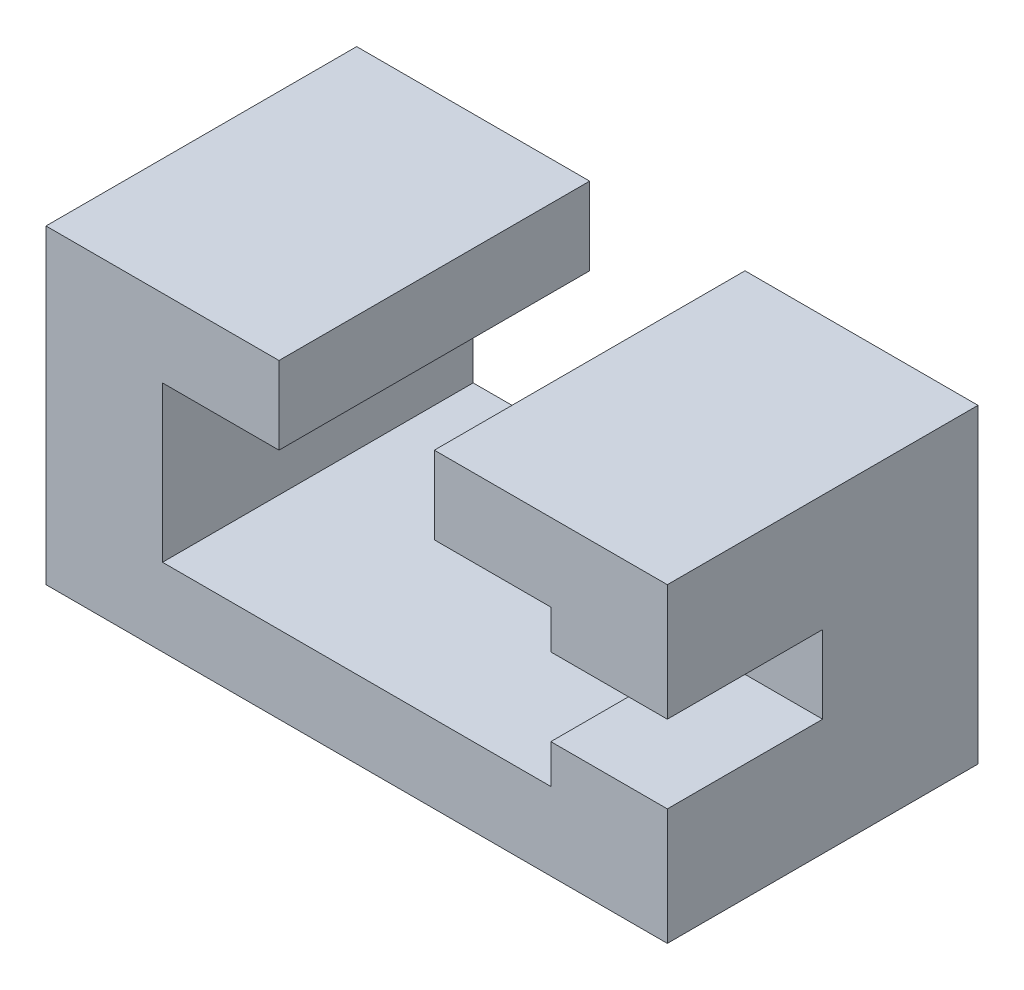
ISO-10303-21;
HEADER;
FILE_DESCRIPTION(('STEP AP214'),'2;1');
FILE_NAME('part.step','',(''),(''),'','','');
FILE_SCHEMA(('AUTOMOTIVE_DESIGN { 1 0 10303 214 1 1 1 1 }'));
ENDSEC;
DATA;
#1=APPLICATION_CONTEXT('core data for automotive mechanical design processes');
#2=APPLICATION_PROTOCOL_DEFINITION('international standard','automotive_design',2000,#1);
#3=PRODUCT_CONTEXT('',#1,'mechanical');
#4=PRODUCT('Part','Part','',(#3));
#5=PRODUCT_RELATED_PRODUCT_CATEGORY('part','',(#4));
#6=PRODUCT_DEFINITION_FORMATION('','',#4);
#7=PRODUCT_DEFINITION_CONTEXT('part definition',#1,'design');
#8=PRODUCT_DEFINITION('design','',#6,#7);
#9=PRODUCT_DEFINITION_SHAPE('','',#8);
#10=(LENGTH_UNIT() NAMED_UNIT(*) SI_UNIT(.MILLI.,.METRE.));
#11=(NAMED_UNIT(*) PLANE_ANGLE_UNIT() SI_UNIT($,.RADIAN.));
#12=(NAMED_UNIT(*) SI_UNIT($,.STERADIAN.) SOLID_ANGLE_UNIT());
#13=UNCERTAINTY_MEASURE_WITH_UNIT(LENGTH_MEASURE(1.E-05),#10,'distance_accuracy_value','');
#14=(GEOMETRIC_REPRESENTATION_CONTEXT(3) GLOBAL_UNCERTAINTY_ASSIGNED_CONTEXT((#13)) GLOBAL_UNIT_ASSIGNED_CONTEXT((#10,
#11,#12)) REPRESENTATION_CONTEXT('',''));
#15=CARTESIAN_POINT('',(0.,0.,0.));
#16=DIRECTION('',(0.,0.,1.));
#17=DIRECTION('',(1.,0.,0.));
#18=AXIS2_PLACEMENT_3D('',#15,#16,#17);
#19=CARTESIAN_POINT('',(80.,0.,40.));
#20=DIRECTION('',(-1.,0.,0.));
#21=DIRECTION('',(0.,-1.,0.));
#22=AXIS2_PLACEMENT_3D('',#19,#20,#21);
#23=PLANE('',#22);
#24=DIRECTION('',(0.,0.,-1.));
#25=VECTOR('',#24,1.);
#26=CARTESIAN_POINT('',(80.,25.,40.));
#27=LINE('',#26,#25);
#28=CARTESIAN_POINT('',(80.,25.,40.));
#29=VERTEX_POINT('',#28);
#30=CARTESIAN_POINT('',(80.,25.,20.));
#31=VERTEX_POINT('',#30);
#32=EDGE_CURVE('E277',#29,#31,#27,.T.);
#33=ORIENTED_EDGE('',*,*,#32,.T.);
#34=DIRECTION('',(0.,-1.,0.));
#35=VECTOR('',#34,1.);
#36=CARTESIAN_POINT('',(80.,25.,20.));
#37=LINE('',#36,#35);
#38=CARTESIAN_POINT('',(80.,15.,20.));
#39=VERTEX_POINT('',#38);
#40=EDGE_CURVE('E298',#31,#39,#37,.T.);
#41=ORIENTED_EDGE('',*,*,#40,.T.);
#42=DIRECTION('',(0.,0.,1.));
#43=VECTOR('',#42,1.);
#44=CARTESIAN_POINT('',(80.,15.,20.));
#45=LINE('',#44,#43);
#46=CARTESIAN_POINT('',(80.,15.,40.));
#47=VERTEX_POINT('',#46);
#48=EDGE_CURVE('E293',#39,#47,#45,.T.);
#49=ORIENTED_EDGE('',*,*,#48,.T.);
#50=DIRECTION('',(0.,1.,0.));
#51=VECTOR('',#50,1.);
#52=CARTESIAN_POINT('',(80.,0.,40.));
#53=LINE('',#52,#51);
#54=CARTESIAN_POINT('',(80.,0.,40.));
#55=VERTEX_POINT('',#54);
#56=EDGE_CURVE('E237',#55,#47,#53,.T.);
#57=ORIENTED_EDGE('',*,*,#56,.F.);
#58=DIRECTION('',(0.,0.,-1.));
#59=VECTOR('',#58,1.);
#60=CARTESIAN_POINT('',(80.,0.,40.));
#61=LINE('',#60,#59);
#62=CARTESIAN_POINT('',(80.,0.,0.));
#63=VERTEX_POINT('',#62);
#64=EDGE_CURVE('E209',#55,#63,#61,.T.);
#65=ORIENTED_EDGE('',*,*,#64,.T.);
#66=DIRECTION('',(0.,1.,0.));
#67=VECTOR('',#66,1.);
#68=CARTESIAN_POINT('',(80.,0.,0.));
#69=LINE('',#68,#67);
#70=CARTESIAN_POINT('',(80.,40.,0.));
#71=VERTEX_POINT('',#70);
#72=EDGE_CURVE('E174',#63,#71,#69,.T.);
#73=ORIENTED_EDGE('',*,*,#72,.T.);
#74=DIRECTION('',(0.,0.,-1.));
#75=VECTOR('',#74,1.);
#76=CARTESIAN_POINT('',(80.,40.,40.));
#77=LINE('',#76,#75);
#78=CARTESIAN_POINT('',(80.,40.,40.));
#79=VERTEX_POINT('',#78);
#80=EDGE_CURVE('E206',#79,#71,#77,.T.);
#81=ORIENTED_EDGE('',*,*,#80,.F.);
#82=EDGE_CURVE('E241',#29,#79,#53,.T.);
#83=ORIENTED_EDGE('',*,*,#82,.F.);
#84=EDGE_LOOP('',(#33,#41,#49,#57,#65,#73,#81,#83));
#85=FACE_BOUND('',#84,.T.);
#86=ADVANCED_FACE('F33',(#85),#23,.F.);
#87=CARTESIAN_POINT('',(65.,30.,40.));
#88=DIRECTION('',(1.,0.,0.));
#89=DIRECTION('',(0.,0.,-1.));
#90=AXIS2_PLACEMENT_3D('',#87,#88,#89);
#91=PLANE('',#90);
#92=DIRECTION('',(0.,0.,1.));
#93=VECTOR('',#92,1.);
#94=CARTESIAN_POINT('',(65.,25.,40.));
#95=LINE('',#94,#93);
#96=CARTESIAN_POINT('',(65.,25.,20.));
#97=VERTEX_POINT('',#96);
#98=CARTESIAN_POINT('',(65.,25.,40.));
#99=VERTEX_POINT('',#98);
#100=EDGE_CURVE('E291',#97,#99,#95,.T.);
#101=ORIENTED_EDGE('',*,*,#100,.T.);
#102=DIRECTION('',(0.,-1.,0.));
#103=VECTOR('',#102,1.);
#104=CARTESIAN_POINT('',(65.,30.,40.));
#105=LINE('',#104,#103);
#106=CARTESIAN_POINT('',(65.,30.,40.));
#107=VERTEX_POINT('',#106);
#108=EDGE_CURVE('E247',#107,#99,#105,.T.);
#109=ORIENTED_EDGE('',*,*,#108,.F.);
#110=DIRECTION('',(0.,0.,-1.));
#111=VECTOR('',#110,1.);
#112=CARTESIAN_POINT('',(65.,30.,40.));
#113=LINE('',#112,#111);
#114=CARTESIAN_POINT('',(65.,30.,0.));
#115=VERTEX_POINT('',#114);
#116=EDGE_CURVE('E197',#107,#115,#113,.T.);
#117=ORIENTED_EDGE('',*,*,#116,.T.);
#118=DIRECTION('',(0.,-1.,0.));
#119=VECTOR('',#118,1.);
#120=CARTESIAN_POINT('',(65.,30.,0.));
#121=LINE('',#120,#119);
#122=CARTESIAN_POINT('',(65.,9.99999999999999,0.));
#123=VERTEX_POINT('',#122);
#124=EDGE_CURVE('E182',#115,#123,#121,.T.);
#125=ORIENTED_EDGE('',*,*,#124,.T.);
#126=DIRECTION('',(0.,0.,-1.));
#127=VECTOR('',#126,1.);
#128=CARTESIAN_POINT('',(65.,9.99999999999999,40.));
#129=LINE('',#128,#127);
#130=CARTESIAN_POINT('',(65.,9.99999999999999,40.));
#131=VERTEX_POINT('',#130);
#132=EDGE_CURVE('E194',#131,#123,#129,.T.);
#133=ORIENTED_EDGE('',*,*,#132,.F.);
#134=CARTESIAN_POINT('',(65.,15.,40.));
#135=VERTEX_POINT('',#134);
#136=EDGE_CURVE('E246',#135,#131,#105,.T.);
#137=ORIENTED_EDGE('',*,*,#136,.F.);
#138=DIRECTION('',(0.,0.,-1.));
#139=VECTOR('',#138,1.);
#140=CARTESIAN_POINT('',(65.,15.,20.));
#141=LINE('',#140,#139);
#142=CARTESIAN_POINT('',(65.,15.,20.));
#143=VERTEX_POINT('',#142);
#144=EDGE_CURVE('E48',#135,#143,#141,.T.);
#145=ORIENTED_EDGE('',*,*,#144,.T.);
#146=DIRECTION('',(0.,1.,0.));
#147=VECTOR('',#146,1.);
#148=CARTESIAN_POINT('',(65.,25.,20.));
#149=LINE('',#148,#147);
#150=EDGE_CURVE('E296',#143,#97,#149,.T.);
#151=ORIENTED_EDGE('',*,*,#150,.T.);
#152=EDGE_LOOP('',(#101,#109,#117,#125,#133,#137,#145,#151));
#153=FACE_BOUND('',#152,.T.);
#154=ADVANCED_FACE('F257',(#153),#91,.F.);
#155=CARTESIAN_POINT('',(0.,0.,40.));
#156=DIRECTION('',(0.,0.,1.));
#157=DIRECTION('',(1.,0.,0.));
#158=AXIS2_PLACEMENT_3D('',#155,#156,#157);
#159=PLANE('',#158);
#160=ORIENTED_EDGE('',*,*,#108,.T.);
#161=DIRECTION('',(1.,0.,0.));
#162=VECTOR('',#161,1.);
#163=CARTESIAN_POINT('',(-0.00100000000001488,25.,40.));
#164=LINE('',#163,#162);
#165=EDGE_CURVE('E273',#99,#29,#164,.T.);
#166=ORIENTED_EDGE('',*,*,#165,.T.);
#167=ORIENTED_EDGE('',*,*,#82,.T.);
#168=DIRECTION('',(-1.,0.,0.));
#169=VECTOR('',#168,1.);
#170=CARTESIAN_POINT('',(80.,40.,40.));
#171=LINE('',#170,#169);
#172=CARTESIAN_POINT('',(50.,40.,40.));
#173=VERTEX_POINT('',#172);
#174=EDGE_CURVE('E233',#79,#173,#171,.T.);
#175=ORIENTED_EDGE('',*,*,#174,.T.);
#176=DIRECTION('',(0.,-1.,0.));
#177=VECTOR('',#176,1.);
#178=CARTESIAN_POINT('',(50.,40.,40.));
#179=LINE('',#178,#177);
#180=CARTESIAN_POINT('',(50.,30.,40.));
#181=VERTEX_POINT('',#180);
#182=EDGE_CURVE('E236',#173,#181,#179,.T.);
#183=ORIENTED_EDGE('',*,*,#182,.T.);
#184=DIRECTION('',(1.,0.,0.));
#185=VECTOR('',#184,1.);
#186=CARTESIAN_POINT('',(50.,30.,40.));
#187=LINE('',#186,#185);
#188=EDGE_CURVE('E239',#181,#107,#187,.T.);
#189=ORIENTED_EDGE('',*,*,#188,.T.);
#190=EDGE_LOOP('',(#160,#166,#167,#175,#183,#189));
#191=FACE_BOUND('',#190,.T.);
#192=ADVANCED_FACE('F270',(#191),#159,.T.);
#193=ORIENTED_EDGE('',*,*,#56,.T.);
#194=DIRECTION('',(1.,0.,0.));
#195=VECTOR('',#194,1.);
#196=CARTESIAN_POINT('',(-0.001000000000001,15.,40.));
#197=LINE('',#196,#195);
#198=EDGE_CURVE('E254',#135,#47,#197,.T.);
#199=ORIENTED_EDGE('',*,*,#198,.F.);
#200=ORIENTED_EDGE('',*,*,#136,.T.);
#201=DIRECTION('',(-1.,0.,0.));
#202=VECTOR('',#201,1.);
#203=CARTESIAN_POINT('',(65.,9.99999999999999,40.));
#204=LINE('',#203,#202);
#205=CARTESIAN_POINT('',(15.,9.99999999999998,40.));
#206=VERTEX_POINT('',#205);
#207=EDGE_CURVE('E145',#131,#206,#204,.T.);
#208=ORIENTED_EDGE('',*,*,#207,.T.);
#209=DIRECTION('',(0.,1.,0.));
#210=VECTOR('',#209,1.);
#211=CARTESIAN_POINT('',(15.,9.99999999999998,40.));
#212=LINE('',#211,#210);
#213=CARTESIAN_POINT('',(15.,30.,40.));
#214=VERTEX_POINT('',#213);
#215=EDGE_CURVE('E137',#206,#214,#212,.T.);
#216=ORIENTED_EDGE('',*,*,#215,.T.);
#217=DIRECTION('',(1.,0.,0.));
#218=VECTOR('',#217,1.);
#219=CARTESIAN_POINT('',(15.,30.,40.));
#220=LINE('',#219,#218);
#221=CARTESIAN_POINT('',(30.,30.,40.));
#222=VERTEX_POINT('',#221);
#223=EDGE_CURVE('E142',#214,#222,#220,.T.);
#224=ORIENTED_EDGE('',*,*,#223,.T.);
#225=DIRECTION('',(0.,1.,0.));
#226=VECTOR('',#225,1.);
#227=CARTESIAN_POINT('',(30.,30.,40.));
#228=LINE('',#227,#226);
#229=CARTESIAN_POINT('',(30.,40.,40.));
#230=VERTEX_POINT('',#229);
#231=EDGE_CURVE('E57',#222,#230,#228,.T.);
#232=ORIENTED_EDGE('',*,*,#231,.T.);
#233=DIRECTION('',(-1.,0.,0.));
#234=VECTOR('',#233,1.);
#235=CARTESIAN_POINT('',(30.,40.,40.));
#236=LINE('',#235,#234);
#237=CARTESIAN_POINT('',(0.,40.,40.));
#238=VERTEX_POINT('',#237);
#239=EDGE_CURVE('E190',#230,#238,#236,.T.);
#240=ORIENTED_EDGE('',*,*,#239,.T.);
#241=DIRECTION('',(0.,-1.,0.));
#242=VECTOR('',#241,1.);
#243=CARTESIAN_POINT('',(0.,40.,40.));
#244=LINE('',#243,#242);
#245=CARTESIAN_POINT('',(0.,0.,40.));
#246=VERTEX_POINT('',#245);
#247=EDGE_CURVE('E110',#238,#246,#244,.T.);
#248=ORIENTED_EDGE('',*,*,#247,.T.);
#249=DIRECTION('',(1.,0.,0.));
#250=VECTOR('',#249,1.);
#251=CARTESIAN_POINT('',(0.,0.,40.));
#252=LINE('',#251,#250);
#253=EDGE_CURVE('E217',#246,#55,#252,.T.);
#254=ORIENTED_EDGE('',*,*,#253,.T.);
#255=EDGE_LOOP('',(#193,#199,#200,#208,#216,#224,#232,#240,#248,#254));
#256=FACE_BOUND('',#255,.T.);
#257=ADVANCED_FACE('F140',(#256),#159,.T.);
#258=CARTESIAN_POINT('',(30.,40.,40.));
#259=DIRECTION('',(0.,-1.,0.));
#260=DIRECTION('',(1.,0.,0.));
#261=AXIS2_PLACEMENT_3D('',#258,#259,#260);
#262=PLANE('',#261);
#263=DIRECTION('',(-1.,0.,0.));
#264=VECTOR('',#263,1.);
#265=CARTESIAN_POINT('',(30.,40.,0.));
#266=LINE('',#265,#264);
#267=CARTESIAN_POINT('',(30.,40.,0.));
#268=VERTEX_POINT('',#267);
#269=CARTESIAN_POINT('',(0.,40.,0.));
#270=VERTEX_POINT('',#269);
#271=EDGE_CURVE('E166',#268,#270,#266,.T.);
#272=ORIENTED_EDGE('',*,*,#271,.T.);
#273=DIRECTION('',(0.,0.,-1.));
#274=VECTOR('',#273,1.);
#275=CARTESIAN_POINT('',(0.,40.,40.));
#276=LINE('',#275,#274);
#277=EDGE_CURVE('E11',#238,#270,#276,.T.);
#278=ORIENTED_EDGE('',*,*,#277,.F.);
#279=ORIENTED_EDGE('',*,*,#239,.F.);
#280=DIRECTION('',(0.,0.,-1.));
#281=VECTOR('',#280,1.);
#282=CARTESIAN_POINT('',(30.,40.,40.));
#283=LINE('',#282,#281);
#284=EDGE_CURVE('E162',#230,#268,#283,.T.);
#285=ORIENTED_EDGE('',*,*,#284,.T.);
#286=EDGE_LOOP('',(#272,#278,#279,#285));
#287=FACE_BOUND('',#286,.T.);
#288=ADVANCED_FACE('F35',(#287),#262,.F.);
#289=CARTESIAN_POINT('',(0.,40.,40.));
#290=DIRECTION('',(1.,0.,0.));
#291=DIRECTION('',(0.,1.,0.));
#292=AXIS2_PLACEMENT_3D('',#289,#290,#291);
#293=PLANE('',#292);
#294=DIRECTION('',(0.,-1.,0.));
#295=VECTOR('',#294,1.);
#296=CARTESIAN_POINT('',(0.,40.,0.));
#297=LINE('',#296,#295);
#298=CARTESIAN_POINT('',(0.,0.,0.));
#299=VERTEX_POINT('',#298);
#300=EDGE_CURVE('E169',#270,#299,#297,.T.);
#301=ORIENTED_EDGE('',*,*,#300,.T.);
#302=DIRECTION('',(0.,0.,-1.));
#303=VECTOR('',#302,1.);
#304=CARTESIAN_POINT('',(0.,0.,40.));
#305=LINE('',#304,#303);
#306=EDGE_CURVE('E41',#246,#299,#305,.T.);
#307=ORIENTED_EDGE('',*,*,#306,.F.);
#308=ORIENTED_EDGE('',*,*,#247,.F.);
#309=ORIENTED_EDGE('',*,*,#277,.T.);
#310=EDGE_LOOP('',(#301,#307,#308,#309));
#311=FACE_BOUND('',#310,.T.);
#312=ADVANCED_FACE('F329',(#311),#293,.F.);
#313=CARTESIAN_POINT('',(0.,0.,40.));
#314=DIRECTION('',(0.,1.,0.));
#315=DIRECTION('',(0.,0.,1.));
#316=AXIS2_PLACEMENT_3D('',#313,#314,#315);
#317=PLANE('',#316);
#318=DIRECTION('',(1.,0.,0.));
#319=VECTOR('',#318,1.);
#320=CARTESIAN_POINT('',(0.,0.,0.));
#321=LINE('',#320,#319);
#322=EDGE_CURVE('E172',#299,#63,#321,.T.);
#323=ORIENTED_EDGE('',*,*,#322,.T.);
#324=ORIENTED_EDGE('',*,*,#64,.F.);
#325=ORIENTED_EDGE('',*,*,#253,.F.);
#326=ORIENTED_EDGE('',*,*,#306,.T.);
#327=EDGE_LOOP('',(#323,#324,#325,#326));
#328=FACE_BOUND('',#327,.T.);
#329=ADVANCED_FACE('F215',(#328),#317,.F.);
#330=CARTESIAN_POINT('',(80.,40.,40.));
#331=DIRECTION('',(0.,-1.,0.));
#332=DIRECTION('',(0.,0.,-1.));
#333=AXIS2_PLACEMENT_3D('',#330,#331,#332);
#334=PLANE('',#333);
#335=DIRECTION('',(-1.,0.,0.));
#336=VECTOR('',#335,1.);
#337=CARTESIAN_POINT('',(80.,40.,0.));
#338=LINE('',#337,#336);
#339=CARTESIAN_POINT('',(50.,40.,0.));
#340=VERTEX_POINT('',#339);
#341=EDGE_CURVE('E176',#71,#340,#338,.T.);
#342=ORIENTED_EDGE('',*,*,#341,.T.);
#343=DIRECTION('',(0.,0.,-1.));
#344=VECTOR('',#343,1.);
#345=CARTESIAN_POINT('',(50.,40.,40.));
#346=LINE('',#345,#344);
#347=EDGE_CURVE('E203',#173,#340,#346,.T.);
#348=ORIENTED_EDGE('',*,*,#347,.F.);
#349=ORIENTED_EDGE('',*,*,#174,.F.);
#350=ORIENTED_EDGE('',*,*,#80,.T.);
#351=EDGE_LOOP('',(#342,#348,#349,#350));
#352=FACE_BOUND('',#351,.T.);
#353=ADVANCED_FACE('F231',(#352),#334,.F.);
#354=CARTESIAN_POINT('',(50.,40.,40.));
#355=DIRECTION('',(1.,0.,0.));
#356=DIRECTION('',(0.,0.,-1.));
#357=AXIS2_PLACEMENT_3D('',#354,#355,#356);
#358=PLANE('',#357);
#359=DIRECTION('',(0.,-1.,0.));
#360=VECTOR('',#359,1.);
#361=CARTESIAN_POINT('',(50.,40.,0.));
#362=LINE('',#361,#360);
#363=CARTESIAN_POINT('',(50.,30.,0.));
#364=VERTEX_POINT('',#363);
#365=EDGE_CURVE('E178',#340,#364,#362,.T.);
#366=ORIENTED_EDGE('',*,*,#365,.T.);
#367=DIRECTION('',(0.,0.,-1.));
#368=VECTOR('',#367,1.);
#369=CARTESIAN_POINT('',(50.,30.,40.));
#370=LINE('',#369,#368);
#371=EDGE_CURVE('E200',#181,#364,#370,.T.);
#372=ORIENTED_EDGE('',*,*,#371,.F.);
#373=ORIENTED_EDGE('',*,*,#182,.F.);
#374=ORIENTED_EDGE('',*,*,#347,.T.);
#375=EDGE_LOOP('',(#366,#372,#373,#374));
#376=FACE_BOUND('',#375,.T.);
#377=ADVANCED_FACE('F355',(#376),#358,.F.);
#378=CARTESIAN_POINT('',(50.,30.,40.));
#379=DIRECTION('',(0.,1.,0.));
#380=DIRECTION('',(-1.,0.,0.));
#381=AXIS2_PLACEMENT_3D('',#378,#379,#380);
#382=PLANE('',#381);
#383=DIRECTION('',(1.,0.,0.));
#384=VECTOR('',#383,1.);
#385=CARTESIAN_POINT('',(50.,30.,0.));
#386=LINE('',#385,#384);
#387=EDGE_CURVE('E180',#364,#115,#386,.T.);
#388=ORIENTED_EDGE('',*,*,#387,.T.);
#389=ORIENTED_EDGE('',*,*,#116,.F.);
#390=ORIENTED_EDGE('',*,*,#188,.F.);
#391=ORIENTED_EDGE('',*,*,#371,.T.);
#392=EDGE_LOOP('',(#388,#389,#390,#391));
#393=FACE_BOUND('',#392,.T.);
#394=ADVANCED_FACE('F352',(#393),#382,.F.);
#395=CARTESIAN_POINT('',(65.,9.99999999999999,40.));
#396=DIRECTION('',(0.,-1.,0.));
#397=DIRECTION('',(1.,0.,0.));
#398=AXIS2_PLACEMENT_3D('',#395,#396,#397);
#399=PLANE('',#398);
#400=DIRECTION('',(-1.,0.,0.));
#401=VECTOR('',#400,1.);
#402=CARTESIAN_POINT('',(65.,9.99999999999999,0.));
#403=LINE('',#402,#401);
#404=CARTESIAN_POINT('',(15.,9.99999999999998,0.));
#405=VERTEX_POINT('',#404);
#406=EDGE_CURVE('E184',#123,#405,#403,.T.);
#407=ORIENTED_EDGE('',*,*,#406,.T.);
#408=DIRECTION('',(0.,0.,-1.));
#409=VECTOR('',#408,1.);
#410=CARTESIAN_POINT('',(15.,9.99999999999998,40.));
#411=LINE('',#410,#409);
#412=EDGE_CURVE('E157',#206,#405,#411,.T.);
#413=ORIENTED_EDGE('',*,*,#412,.F.);
#414=ORIENTED_EDGE('',*,*,#207,.F.);
#415=ORIENTED_EDGE('',*,*,#132,.T.);
#416=EDGE_LOOP('',(#407,#413,#414,#415));
#417=FACE_BOUND('',#416,.T.);
#418=ADVANCED_FACE('F261',(#417),#399,.F.);
#419=CARTESIAN_POINT('',(15.,9.99999999999998,40.));
#420=DIRECTION('',(-1.,0.,0.));
#421=DIRECTION('',(0.,-1.,0.));
#422=AXIS2_PLACEMENT_3D('',#419,#420,#421);
#423=PLANE('',#422);
#424=DIRECTION('',(0.,1.,0.));
#425=VECTOR('',#424,1.);
#426=CARTESIAN_POINT('',(15.,9.99999999999998,0.));
#427=LINE('',#426,#425);
#428=CARTESIAN_POINT('',(15.,30.,0.));
#429=VERTEX_POINT('',#428);
#430=EDGE_CURVE('E154',#405,#429,#427,.T.);
#431=ORIENTED_EDGE('',*,*,#430,.T.);
#432=DIRECTION('',(0.,0.,-1.));
#433=VECTOR('',#432,1.);
#434=CARTESIAN_POINT('',(15.,30.,40.));
#435=LINE('',#434,#433);
#436=EDGE_CURVE('E151',#214,#429,#435,.T.);
#437=ORIENTED_EDGE('',*,*,#436,.F.);
#438=ORIENTED_EDGE('',*,*,#215,.F.);
#439=ORIENTED_EDGE('',*,*,#412,.T.);
#440=EDGE_LOOP('',(#431,#437,#438,#439));
#441=FACE_BOUND('',#440,.T.);
#442=ADVANCED_FACE('F152',(#441),#423,.F.);
#443=CARTESIAN_POINT('',(15.,30.,40.));
#444=DIRECTION('',(0.,1.,0.));
#445=DIRECTION('',(-1.,0.,0.));
#446=AXIS2_PLACEMENT_3D('',#443,#444,#445);
#447=PLANE('',#446);
#448=DIRECTION('',(1.,0.,0.));
#449=VECTOR('',#448,1.);
#450=CARTESIAN_POINT('',(15.,30.,0.));
#451=LINE('',#450,#449);
#452=CARTESIAN_POINT('',(30.,30.,0.));
#453=VERTEX_POINT('',#452);
#454=EDGE_CURVE('E187',#429,#453,#451,.T.);
#455=ORIENTED_EDGE('',*,*,#454,.T.);
#456=DIRECTION('',(0.,0.,-1.));
#457=VECTOR('',#456,1.);
#458=CARTESIAN_POINT('',(30.,30.,40.));
#459=LINE('',#458,#457);
#460=EDGE_CURVE('E158',#222,#453,#459,.T.);
#461=ORIENTED_EDGE('',*,*,#460,.F.);
#462=ORIENTED_EDGE('',*,*,#223,.F.);
#463=ORIENTED_EDGE('',*,*,#436,.T.);
#464=EDGE_LOOP('',(#455,#461,#462,#463));
#465=FACE_BOUND('',#464,.T.);
#466=ADVANCED_FACE('F160',(#465),#447,.F.);
#467=CARTESIAN_POINT('',(30.,30.,40.));
#468=DIRECTION('',(-1.,0.,0.));
#469=DIRECTION('',(0.,0.,1.));
#470=AXIS2_PLACEMENT_3D('',#467,#468,#469);
#471=PLANE('',#470);
#472=DIRECTION('',(0.,1.,0.));
#473=VECTOR('',#472,1.);
#474=CARTESIAN_POINT('',(30.,30.,0.));
#475=LINE('',#474,#473);
#476=EDGE_CURVE('E102',#453,#268,#475,.T.);
#477=ORIENTED_EDGE('',*,*,#476,.T.);
#478=ORIENTED_EDGE('',*,*,#284,.F.);
#479=ORIENTED_EDGE('',*,*,#231,.F.);
#480=ORIENTED_EDGE('',*,*,#460,.T.);
#481=EDGE_LOOP('',(#477,#478,#479,#480));
#482=FACE_BOUND('',#481,.T.);
#483=ADVANCED_FACE('F262',(#482),#471,.F.);
#484=CARTESIAN_POINT('',(0.,0.,0.));
#485=DIRECTION('',(0.,0.,1.));
#486=DIRECTION('',(1.,0.,0.));
#487=AXIS2_PLACEMENT_3D('',#484,#485,#486);
#488=PLANE('',#487);
#489=ORIENTED_EDGE('',*,*,#271,.F.);
#490=ORIENTED_EDGE('',*,*,#476,.F.);
#491=ORIENTED_EDGE('',*,*,#454,.F.);
#492=ORIENTED_EDGE('',*,*,#430,.F.);
#493=ORIENTED_EDGE('',*,*,#406,.F.);
#494=ORIENTED_EDGE('',*,*,#124,.F.);
#495=ORIENTED_EDGE('',*,*,#387,.F.);
#496=ORIENTED_EDGE('',*,*,#365,.F.);
#497=ORIENTED_EDGE('',*,*,#341,.F.);
#498=ORIENTED_EDGE('',*,*,#72,.F.);
#499=ORIENTED_EDGE('',*,*,#322,.F.);
#500=ORIENTED_EDGE('',*,*,#300,.F.);
#501=EDGE_LOOP('',(#489,#490,#491,#492,#493,#494,#495,#496,#497,#498,#499,#500));
#502=FACE_BOUND('',#501,.T.);
#503=ADVANCED_FACE('F221',(#502),#488,.F.);
#504=CARTESIAN_POINT('',(-0.00100000000001488,25.,40.));
#505=DIRECTION('',(0.,-1.,0.));
#506=DIRECTION('',(1.,0.,0.));
#507=AXIS2_PLACEMENT_3D('',#504,#505,#506);
#508=PLANE('',#507);
#509=DIRECTION('',(1.,0.,0.));
#510=VECTOR('',#509,1.);
#511=CARTESIAN_POINT('',(-0.00100000000001488,25.,20.));
#512=LINE('',#511,#510);
#513=EDGE_CURVE('E170',#97,#31,#512,.T.);
#514=ORIENTED_EDGE('',*,*,#513,.T.);
#515=ORIENTED_EDGE('',*,*,#32,.F.);
#516=ORIENTED_EDGE('',*,*,#165,.F.);
#517=ORIENTED_EDGE('',*,*,#100,.F.);
#518=EDGE_LOOP('',(#514,#515,#516,#517));
#519=FACE_BOUND('',#518,.T.);
#520=ADVANCED_FACE('F290',(#519),#508,.T.);
#521=CARTESIAN_POINT('',(-0.00100000000001488,25.,20.));
#522=DIRECTION('',(0.,0.,1.));
#523=DIRECTION('',(1.,0.,0.));
#524=AXIS2_PLACEMENT_3D('',#521,#522,#523);
#525=PLANE('',#524);
#526=DIRECTION('',(1.,0.,0.));
#527=VECTOR('',#526,1.);
#528=CARTESIAN_POINT('',(-0.001000000000001,15.,20.));
#529=LINE('',#528,#527);
#530=EDGE_CURVE('E306',#143,#39,#529,.T.);
#531=ORIENTED_EDGE('',*,*,#530,.T.);
#532=ORIENTED_EDGE('',*,*,#40,.F.);
#533=ORIENTED_EDGE('',*,*,#513,.F.);
#534=ORIENTED_EDGE('',*,*,#150,.F.);
#535=EDGE_LOOP('',(#531,#532,#533,#534));
#536=FACE_BOUND('',#535,.T.);
#537=ADVANCED_FACE('F311',(#536),#525,.T.);
#538=CARTESIAN_POINT('',(-0.001000000000001,15.,20.));
#539=DIRECTION('',(0.,1.,0.));
#540=DIRECTION('',(-1.,0.,0.));
#541=AXIS2_PLACEMENT_3D('',#538,#539,#540);
#542=PLANE('',#541);
#543=ORIENTED_EDGE('',*,*,#198,.T.);
#544=ORIENTED_EDGE('',*,*,#48,.F.);
#545=ORIENTED_EDGE('',*,*,#530,.F.);
#546=ORIENTED_EDGE('',*,*,#144,.F.);
#547=EDGE_LOOP('',(#543,#544,#545,#546));
#548=FACE_BOUND('',#547,.T.);
#549=ADVANCED_FACE('F312',(#548),#542,.T.);
#550=CLOSED_SHELL('',(#86,#154,#192,#257,#288,#312,#329,#353,#377,#394,#418,#442,#466,#483,#503,
#520,#537,#549));
#551=MANIFOLD_SOLID_BREP('B2',#550);
#552=ADVANCED_BREP_SHAPE_REPRESENTATION('',(#18,#551),#14);
#553=SHAPE_DEFINITION_REPRESENTATION(#9,#552);
ENDSEC;
END-ISO-10303-21;
